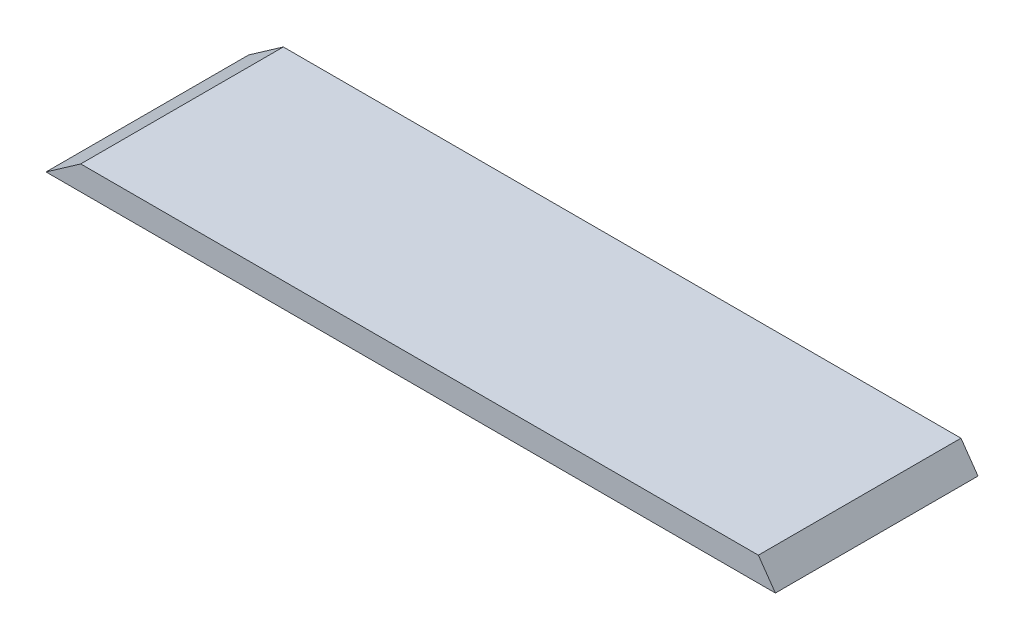
ISO-10303-21;
HEADER;
FILE_DESCRIPTION(('STEP AP214'),'2;1');
FILE_NAME('part.step','',(''),(''),'','','');
FILE_SCHEMA(('AUTOMOTIVE_DESIGN { 1 0 10303 214 1 1 1 1 }'));
ENDSEC;
DATA;
#1=APPLICATION_CONTEXT('core data for automotive mechanical design processes');
#2=APPLICATION_PROTOCOL_DEFINITION('international standard','automotive_design',2000,#1);
#3=PRODUCT_CONTEXT('',#1,'mechanical');
#4=PRODUCT('Part','Part','',(#3));
#5=PRODUCT_RELATED_PRODUCT_CATEGORY('part','',(#4));
#6=PRODUCT_DEFINITION_FORMATION('','',#4);
#7=PRODUCT_DEFINITION_CONTEXT('part definition',#1,'design');
#8=PRODUCT_DEFINITION('design','',#6,#7);
#9=PRODUCT_DEFINITION_SHAPE('','',#8);
#10=(LENGTH_UNIT() NAMED_UNIT(*) SI_UNIT(.MILLI.,.METRE.));
#11=(NAMED_UNIT(*) PLANE_ANGLE_UNIT() SI_UNIT($,.RADIAN.));
#12=(NAMED_UNIT(*) SI_UNIT($,.STERADIAN.) SOLID_ANGLE_UNIT());
#13=UNCERTAINTY_MEASURE_WITH_UNIT(LENGTH_MEASURE(1.E-05),#10,'distance_accuracy_value','');
#14=(GEOMETRIC_REPRESENTATION_CONTEXT(3) GLOBAL_UNCERTAINTY_ASSIGNED_CONTEXT((#13)) GLOBAL_UNIT_ASSIGNED_CONTEXT((#10,
#11,#12)) REPRESENTATION_CONTEXT('',''));
#15=CARTESIAN_POINT('',(0.,0.,0.));
#16=DIRECTION('',(0.,0.,1.));
#17=DIRECTION('',(1.,0.,0.));
#18=AXIS2_PLACEMENT_3D('',#15,#16,#17);
#19=CARTESIAN_POINT('',(-40.7155559797737,2.99999999999999,25.));
#20=DIRECTION('',(0.57357643635105,-0.819152044288989,0.));
#21=DIRECTION('',(0.819152044288989,0.57357643635105,0.));
#22=AXIS2_PLACEMENT_3D('',#19,#20,#21);
#23=PLANE('',#22);
#24=DIRECTION('',(-0.819152044288989,-0.57357643635105,0.));
#25=VECTOR('',#24,1.);
#26=CARTESIAN_POINT('',(-40.7155559797737,2.99999999999999,0.));
#27=LINE('',#26,#25);
#28=CARTESIAN_POINT('',(-40.7155559797737,2.99999999999999,0.));
#29=VERTEX_POINT('',#28);
#30=CARTESIAN_POINT('',(-45.,0.,0.));
#31=VERTEX_POINT('',#30);
#32=EDGE_CURVE('E100',#29,#31,#27,.T.);
#33=ORIENTED_EDGE('',*,*,#32,.T.);
#34=DIRECTION('',(0.,0.,-1.));
#35=VECTOR('',#34,1.);
#36=CARTESIAN_POINT('',(-45.,0.,25.));
#37=LINE('',#36,#35);
#38=CARTESIAN_POINT('',(-45.,0.,25.));
#39=VERTEX_POINT('',#38);
#40=EDGE_CURVE('E11',#39,#31,#37,.T.);
#41=ORIENTED_EDGE('',*,*,#40,.F.);
#42=DIRECTION('',(-0.819152044288989,-0.57357643635105,0.));
#43=VECTOR('',#42,1.);
#44=CARTESIAN_POINT('',(-40.7155559797737,2.99999999999999,25.));
#45=LINE('',#44,#43);
#46=CARTESIAN_POINT('',(-40.7155559797737,2.99999999999999,25.));
#47=VERTEX_POINT('',#46);
#48=EDGE_CURVE('E88',#47,#39,#45,.T.);
#49=ORIENTED_EDGE('',*,*,#48,.F.);
#50=DIRECTION('',(0.,0.,-1.));
#51=VECTOR('',#50,1.);
#52=CARTESIAN_POINT('',(-40.7155559797737,2.99999999999999,25.));
#53=LINE('',#52,#51);
#54=EDGE_CURVE('E96',#47,#29,#53,.T.);
#55=ORIENTED_EDGE('',*,*,#54,.T.);
#56=EDGE_LOOP('',(#33,#41,#49,#55));
#57=FACE_BOUND('',#56,.T.);
#58=ADVANCED_FACE('F37',(#57),#23,.F.);
#59=CARTESIAN_POINT('',(-45.,0.,25.));
#60=DIRECTION('',(0.,1.,0.));
#61=DIRECTION('',(0.,0.,1.));
#62=AXIS2_PLACEMENT_3D('',#59,#60,#61);
#63=PLANE('',#62);
#64=DIRECTION('',(1.,0.,0.));
#65=VECTOR('',#64,1.);
#66=CARTESIAN_POINT('',(-45.,0.,0.));
#67=LINE('',#66,#65);
#68=CARTESIAN_POINT('',(45.,0.,0.));
#69=VERTEX_POINT('',#68);
#70=EDGE_CURVE('E92',#31,#69,#67,.T.);
#71=ORIENTED_EDGE('',*,*,#70,.T.);
#72=DIRECTION('',(0.,0.,-1.));
#73=VECTOR('',#72,1.);
#74=CARTESIAN_POINT('',(45.,0.,25.));
#75=LINE('',#74,#73);
#76=CARTESIAN_POINT('',(45.,0.,25.));
#77=VERTEX_POINT('',#76);
#78=EDGE_CURVE('E45',#77,#69,#75,.T.);
#79=ORIENTED_EDGE('',*,*,#78,.F.);
#80=DIRECTION('',(1.,0.,0.));
#81=VECTOR('',#80,1.);
#82=CARTESIAN_POINT('',(-45.,0.,25.));
#83=LINE('',#82,#81);
#84=EDGE_CURVE('E83',#39,#77,#83,.T.);
#85=ORIENTED_EDGE('',*,*,#84,.F.);
#86=ORIENTED_EDGE('',*,*,#40,.T.);
#87=EDGE_LOOP('',(#71,#79,#85,#86));
#88=FACE_BOUND('',#87,.T.);
#89=ADVANCED_FACE('F91',(#88),#63,.F.);
#90=CARTESIAN_POINT('',(45.,0.,25.));
#91=DIRECTION('',(-0.819152044288991,-0.573576436351047,0.));
#92=DIRECTION('',(0.573576436351047,-0.819152044288991,0.));
#93=AXIS2_PLACEMENT_3D('',#90,#91,#92);
#94=PLANE('',#93);
#95=DIRECTION('',(-0.573576436351047,0.819152044288991,0.));
#96=VECTOR('',#95,1.);
#97=CARTESIAN_POINT('',(45.,0.,0.));
#98=LINE('',#97,#96);
#99=CARTESIAN_POINT('',(42.8993773853709,3.,0.));
#100=VERTEX_POINT('',#99);
#101=EDGE_CURVE('E70',#69,#100,#98,.T.);
#102=ORIENTED_EDGE('',*,*,#101,.T.);
#103=DIRECTION('',(0.,0.,-1.));
#104=VECTOR('',#103,1.);
#105=CARTESIAN_POINT('',(42.8993773853709,3.,25.));
#106=LINE('',#105,#104);
#107=CARTESIAN_POINT('',(42.8993773853709,3.,25.));
#108=VERTEX_POINT('',#107);
#109=EDGE_CURVE('E93',#108,#100,#106,.T.);
#110=ORIENTED_EDGE('',*,*,#109,.F.);
#111=DIRECTION('',(-0.573576436351047,0.819152044288991,0.));
#112=VECTOR('',#111,1.);
#113=CARTESIAN_POINT('',(45.,0.,25.));
#114=LINE('',#113,#112);
#115=EDGE_CURVE('E86',#77,#108,#114,.T.);
#116=ORIENTED_EDGE('',*,*,#115,.F.);
#117=ORIENTED_EDGE('',*,*,#78,.T.);
#118=EDGE_LOOP('',(#102,#110,#116,#117));
#119=FACE_BOUND('',#118,.T.);
#120=ADVANCED_FACE('F94',(#119),#94,.F.);
#121=CARTESIAN_POINT('',(42.8993773853709,3.,25.));
#122=DIRECTION('',(0.,-1.,0.));
#123=DIRECTION('',(1.,0.,0.));
#124=AXIS2_PLACEMENT_3D('',#121,#122,#123);
#125=PLANE('',#124);
#126=DIRECTION('',(-1.,0.,0.));
#127=VECTOR('',#126,1.);
#128=CARTESIAN_POINT('',(42.8993773853709,3.,0.));
#129=LINE('',#128,#127);
#130=EDGE_CURVE('E76',#100,#29,#129,.T.);
#131=ORIENTED_EDGE('',*,*,#130,.T.);
#132=ORIENTED_EDGE('',*,*,#54,.F.);
#133=DIRECTION('',(-1.,0.,0.));
#134=VECTOR('',#133,1.);
#135=CARTESIAN_POINT('',(42.8993773853709,3.,25.));
#136=LINE('',#135,#134);
#137=EDGE_CURVE('E53',#108,#47,#136,.T.);
#138=ORIENTED_EDGE('',*,*,#137,.F.);
#139=ORIENTED_EDGE('',*,*,#109,.T.);
#140=EDGE_LOOP('',(#131,#132,#138,#139));
#141=FACE_BOUND('',#140,.T.);
#142=ADVANCED_FACE('F107',(#141),#125,.F.);
#143=CARTESIAN_POINT('',(0.,0.,25.));
#144=DIRECTION('',(0.,0.,-1.));
#145=DIRECTION('',(-1.,0.,0.));
#146=AXIS2_PLACEMENT_3D('',#143,#144,#145);
#147=PLANE('',#146);
#148=ORIENTED_EDGE('',*,*,#48,.T.);
#149=ORIENTED_EDGE('',*,*,#84,.T.);
#150=ORIENTED_EDGE('',*,*,#115,.T.);
#151=ORIENTED_EDGE('',*,*,#137,.T.);
#152=EDGE_LOOP('',(#148,#149,#150,#151));
#153=FACE_BOUND('',#152,.T.);
#154=ADVANCED_FACE('F84',(#153),#147,.F.);
#155=CARTESIAN_POINT('',(0.,0.,0.));
#156=DIRECTION('',(0.,0.,-1.));
#157=DIRECTION('',(-1.,0.,0.));
#158=AXIS2_PLACEMENT_3D('',#155,#156,#157);
#159=PLANE('',#158);
#160=ORIENTED_EDGE('',*,*,#32,.F.);
#161=ORIENTED_EDGE('',*,*,#130,.F.);
#162=ORIENTED_EDGE('',*,*,#101,.F.);
#163=ORIENTED_EDGE('',*,*,#70,.F.);
#164=EDGE_LOOP('',(#160,#161,#162,#163));
#165=FACE_BOUND('',#164,.T.);
#166=ADVANCED_FACE('F110',(#165),#159,.T.);
#167=CLOSED_SHELL('',(#58,#89,#120,#142,#154,#166));
#168=MANIFOLD_SOLID_BREP('B2',#167);
#169=ADVANCED_BREP_SHAPE_REPRESENTATION('',(#18,#168),#14);
#170=SHAPE_DEFINITION_REPRESENTATION(#9,#169);
ENDSEC;
END-ISO-10303-21;
